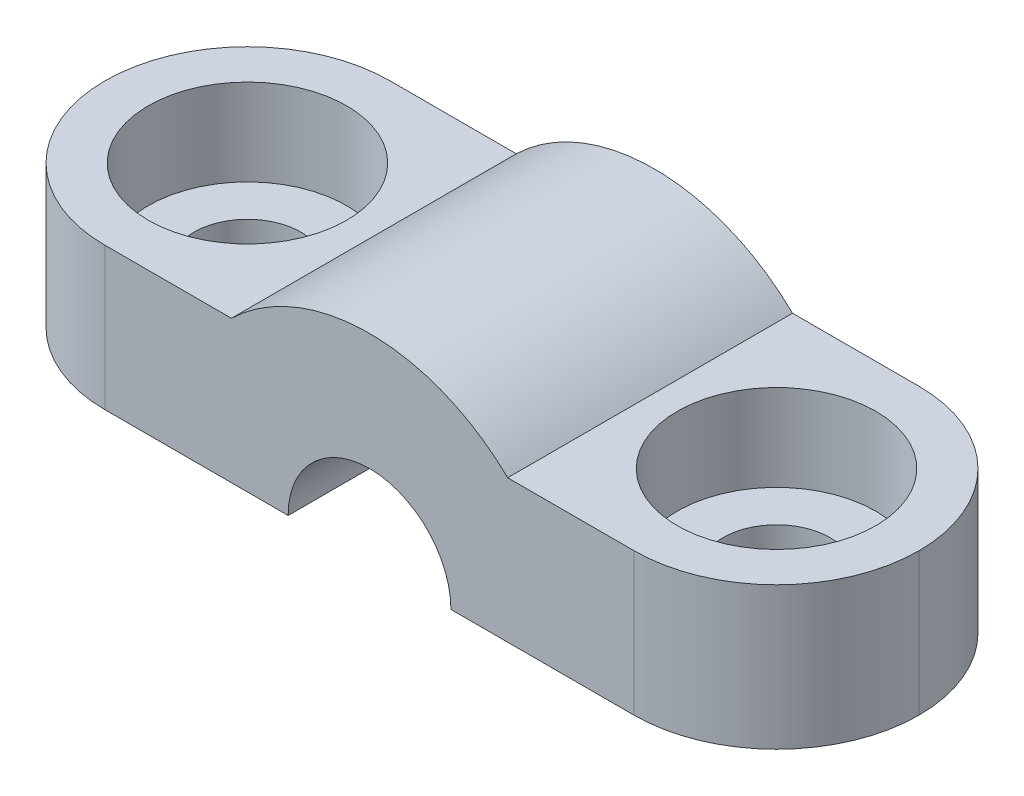
ISO-10303-21;
HEADER;
FILE_DESCRIPTION(('STEP AP214'),'2;1');
FILE_NAME('part.step','',(''),(''),'','','');
FILE_SCHEMA(('AUTOMOTIVE_DESIGN { 1 0 10303 214 1 1 1 1 }'));
ENDSEC;
DATA;
#1=APPLICATION_CONTEXT('core data for automotive mechanical design processes');
#2=APPLICATION_PROTOCOL_DEFINITION('international standard','automotive_design',2000,#1);
#3=PRODUCT_CONTEXT('',#1,'mechanical');
#4=PRODUCT('Part','Part','',(#3));
#5=PRODUCT_RELATED_PRODUCT_CATEGORY('part','',(#4));
#6=PRODUCT_DEFINITION_FORMATION('','',#4);
#7=PRODUCT_DEFINITION_CONTEXT('part definition',#1,'design');
#8=PRODUCT_DEFINITION('design','',#6,#7);
#9=PRODUCT_DEFINITION_SHAPE('','',#8);
#10=(LENGTH_UNIT() NAMED_UNIT(*) SI_UNIT(.MILLI.,.METRE.));
#11=(NAMED_UNIT(*) PLANE_ANGLE_UNIT() SI_UNIT($,.RADIAN.));
#12=(NAMED_UNIT(*) SI_UNIT($,.STERADIAN.) SOLID_ANGLE_UNIT());
#13=UNCERTAINTY_MEASURE_WITH_UNIT(LENGTH_MEASURE(1.E-05),#10,'distance_accuracy_value','');
#14=(GEOMETRIC_REPRESENTATION_CONTEXT(3) GLOBAL_UNCERTAINTY_ASSIGNED_CONTEXT((#13)) GLOBAL_UNIT_ASSIGNED_CONTEXT((#10,
#11,#12)) REPRESENTATION_CONTEXT('',''));
#15=CARTESIAN_POINT('',(0.,0.,0.));
#16=DIRECTION('',(0.,0.,1.));
#17=DIRECTION('',(1.,0.,0.));
#18=AXIS2_PLACEMENT_3D('',#15,#16,#17);
#19=CARTESIAN_POINT('',(20.,0.,7.));
#20=DIRECTION('',(0.,1.,0.));
#21=DIRECTION('',(0.,0.,1.));
#22=AXIS2_PLACEMENT_3D('',#19,#20,#21);
#23=PLANE('',#22);
#24=CARTESIAN_POINT('',(-13.,0.,0.));
#25=DIRECTION('',(0.,1.,0.));
#26=DIRECTION('',(0.,0.,1.));
#27=AXIS2_PLACEMENT_3D('',#24,#25,#26);
#28=CIRCLE('',#27,2.625);
#29=CARTESIAN_POINT('',(-13.,0.,2.625));
#30=VERTEX_POINT('',#29);
#31=EDGE_CURVE('E167',#30,#30,#28,.T.);
#32=ORIENTED_EDGE('',*,*,#31,.T.);
#33=EDGE_LOOP('',(#32));
#34=FACE_BOUND('',#33,.T.);
#35=DIRECTION('',(-1.,0.,0.));
#36=VECTOR('',#35,1.);
#37=CARTESIAN_POINT('',(-20.,0.,-7.));
#38=LINE('',#37,#36);
#39=CARTESIAN_POINT('',(-4.00000000000001,0.,-7.));
#40=VERTEX_POINT('',#39);
#41=CARTESIAN_POINT('',(-13.,0.,-7.));
#42=VERTEX_POINT('',#41);
#43=EDGE_CURVE('E132',#40,#42,#38,.T.);
#44=ORIENTED_EDGE('',*,*,#43,.F.);
#45=DIRECTION('',(0.,0.,1.));
#46=VECTOR('',#45,1.);
#47=CARTESIAN_POINT('',(-4.00000000000001,0.,-7.));
#48=LINE('',#47,#46);
#49=CARTESIAN_POINT('',(-4.00000000000001,0.,7.));
#50=VERTEX_POINT('',#49);
#51=EDGE_CURVE('E11',#40,#50,#48,.T.);
#52=ORIENTED_EDGE('',*,*,#51,.T.);
#53=DIRECTION('',(1.,0.,0.));
#54=VECTOR('',#53,1.);
#55=CARTESIAN_POINT('',(-20.,0.,7.));
#56=LINE('',#55,#54);
#57=CARTESIAN_POINT('',(-13.,0.,7.));
#58=VERTEX_POINT('',#57);
#59=EDGE_CURVE('E123',#58,#50,#56,.T.);
#60=ORIENTED_EDGE('',*,*,#59,.F.);
#61=CARTESIAN_POINT('',(-13.,0.,0.));
#62=DIRECTION('',(0.,1.,0.));
#63=DIRECTION('',(0.,0.,1.));
#64=AXIS2_PLACEMENT_3D('',#61,#62,#63);
#65=CIRCLE('',#64,7.);
#66=CARTESIAN_POINT('',(-20.,0.,0.));
#67=VERTEX_POINT('',#66);
#68=EDGE_CURVE('E144',#58,#67,#65,.F.);
#69=ORIENTED_EDGE('',*,*,#68,.T.);
#70=CARTESIAN_POINT('',(-13.,0.,0.));
#71=DIRECTION('',(0.,1.,0.));
#72=DIRECTION('',(0.,0.,1.));
#73=AXIS2_PLACEMENT_3D('',#70,#71,#72);
#74=CIRCLE('',#73,7.);
#75=EDGE_CURVE('E141',#67,#42,#74,.F.);
#76=ORIENTED_EDGE('',*,*,#75,.T.);
#77=EDGE_LOOP('',(#44,#52,#60,#69,#76));
#78=FACE_BOUND('',#77,.T.);
#79=ADVANCED_FACE('F33',(#34,#78),#23,.F.);
#80=CARTESIAN_POINT('',(20.,7.,7.));
#81=DIRECTION('',(0.,1.,0.));
#82=DIRECTION('',(0.,0.,1.));
#83=AXIS2_PLACEMENT_3D('',#80,#81,#82);
#84=PLANE('',#83);
#85=DIRECTION('',(0.,0.,1.));
#86=VECTOR('',#85,1.);
#87=CARTESIAN_POINT('',(-6.78693598024911,7.,-20.8496389844645));
#88=LINE('',#87,#86);
#89=CARTESIAN_POINT('',(-6.78693598024911,7.,-7.));
#90=VERTEX_POINT('',#89);
#91=CARTESIAN_POINT('',(-6.78693598024911,7.,7.));
#92=VERTEX_POINT('',#91);
#93=EDGE_CURVE('E190',#90,#92,#88,.T.);
#94=ORIENTED_EDGE('',*,*,#93,.F.);
#95=DIRECTION('',(-1.,0.,0.));
#96=VECTOR('',#95,1.);
#97=CARTESIAN_POINT('',(-20.,7.,-7.));
#98=LINE('',#97,#96);
#99=CARTESIAN_POINT('',(-13.,7.,-7.));
#100=VERTEX_POINT('',#99);
#101=EDGE_CURVE('E131',#90,#100,#98,.T.);
#102=ORIENTED_EDGE('',*,*,#101,.T.);
#103=CARTESIAN_POINT('',(-13.,7.,0.));
#104=DIRECTION('',(0.,1.,0.));
#105=DIRECTION('',(0.,0.,1.));
#106=AXIS2_PLACEMENT_3D('',#103,#104,#105);
#107=CIRCLE('',#106,7.);
#108=CARTESIAN_POINT('',(-20.,7.,0.));
#109=VERTEX_POINT('',#108);
#110=EDGE_CURVE('E149',#100,#109,#107,.T.);
#111=ORIENTED_EDGE('',*,*,#110,.T.);
#112=CARTESIAN_POINT('',(-13.,7.,0.));
#113=DIRECTION('',(0.,1.,0.));
#114=DIRECTION('',(0.,0.,1.));
#115=AXIS2_PLACEMENT_3D('',#112,#113,#114);
#116=CIRCLE('',#115,7.);
#117=CARTESIAN_POINT('',(-13.,7.,7.));
#118=VERTEX_POINT('',#117);
#119=EDGE_CURVE('E151',#109,#118,#116,.T.);
#120=ORIENTED_EDGE('',*,*,#119,.T.);
#121=DIRECTION('',(1.,0.,0.));
#122=VECTOR('',#121,1.);
#123=CARTESIAN_POINT('',(-20.,7.,7.));
#124=LINE('',#123,#122);
#125=EDGE_CURVE('E139',#118,#92,#124,.T.);
#126=ORIENTED_EDGE('',*,*,#125,.T.);
#127=EDGE_LOOP('',(#94,#102,#111,#120,#126));
#128=FACE_BOUND('',#127,.T.);
#129=CARTESIAN_POINT('',(-13.,7.,0.));
#130=DIRECTION('',(0.,1.,0.));
#131=DIRECTION('',(0.,0.,1.));
#132=AXIS2_PLACEMENT_3D('',#129,#130,#131);
#133=CIRCLE('',#132,4.875);
#134=CARTESIAN_POINT('',(-13.,7.,4.875));
#135=VERTEX_POINT('',#134);
#136=EDGE_CURVE('E175',#135,#135,#133,.T.);
#137=ORIENTED_EDGE('',*,*,#136,.F.);
#138=EDGE_LOOP('',(#137));
#139=FACE_BOUND('',#138,.T.);
#140=ADVANCED_FACE('F237',(#128,#139),#84,.T.);
#141=CARTESIAN_POINT('',(-13.,0.,0.));
#142=DIRECTION('',(0.,1.,0.));
#143=DIRECTION('',(0.,0.,1.));
#144=AXIS2_PLACEMENT_3D('',#141,#142,#143);
#145=CYLINDRICAL_SURFACE('',#144,2.625);
#146=ORIENTED_EDGE('',*,*,#31,.F.);
#147=EDGE_LOOP('',(#146));
#148=FACE_BOUND('',#147,.T.);
#149=CARTESIAN_POINT('',(-13.,2.75,0.));
#150=DIRECTION('',(0.,1.,0.));
#151=DIRECTION('',(0.,0.,1.));
#152=AXIS2_PLACEMENT_3D('',#149,#150,#151);
#153=CIRCLE('',#152,2.625);
#154=CARTESIAN_POINT('',(-13.,2.75,2.625));
#155=VERTEX_POINT('',#154);
#156=EDGE_CURVE('E168',#155,#155,#153,.F.);
#157=ORIENTED_EDGE('',*,*,#156,.F.);
#158=EDGE_LOOP('',(#157));
#159=FACE_BOUND('',#158,.T.);
#160=ADVANCED_FACE('F256',(#148,#159),#145,.F.);
#161=CARTESIAN_POINT('',(-20.,7.,-7.));
#162=DIRECTION('',(0.,0.,1.));
#163=DIRECTION('',(1.,0.,0.));
#164=AXIS2_PLACEMENT_3D('',#161,#162,#163);
#165=PLANE('',#164);
#166=CARTESIAN_POINT('',(13.,0.,-7.));
#167=VERTEX_POINT('',#166);
#168=CARTESIAN_POINT('',(3.99999999999999,0.,-7.));
#169=VERTEX_POINT('',#168);
#170=EDGE_CURVE('E129',#167,#169,#38,.T.);
#171=ORIENTED_EDGE('',*,*,#170,.T.);
#172=CARTESIAN_POINT('',(0.,0.,-7.));
#173=DIRECTION('',(0.,0.,1.));
#174=DIRECTION('',(1.,0.,0.));
#175=AXIS2_PLACEMENT_3D('',#172,#173,#174);
#176=CIRCLE('',#175,4.);
#177=EDGE_CURVE('E48',#169,#40,#176,.T.);
#178=ORIENTED_EDGE('',*,*,#177,.T.);
#179=ORIENTED_EDGE('',*,*,#43,.T.);
#180=DIRECTION('',(0.,-1.,0.));
#181=VECTOR('',#180,1.);
#182=CARTESIAN_POINT('',(-13.,7.,-7.));
#183=LINE('',#182,#181);
#184=EDGE_CURVE('E157',#42,#100,#183,.F.);
#185=ORIENTED_EDGE('',*,*,#184,.T.);
#186=ORIENTED_EDGE('',*,*,#101,.F.);
#187=CARTESIAN_POINT('',(0.,0.,-7.));
#188=DIRECTION('',(0.,0.,1.));
#189=DIRECTION('',(1.,0.,0.));
#190=AXIS2_PLACEMENT_3D('',#187,#188,#189);
#191=CIRCLE('',#190,9.75);
#192=CARTESIAN_POINT('',(6.78693598024911,7.,-7.));
#193=VERTEX_POINT('',#192);
#194=EDGE_CURVE('E187',#90,#193,#191,.F.);
#195=ORIENTED_EDGE('',*,*,#194,.T.);
#196=CARTESIAN_POINT('',(13.,7.,-7.));
#197=VERTEX_POINT('',#196);
#198=EDGE_CURVE('E56',#197,#193,#98,.T.);
#199=ORIENTED_EDGE('',*,*,#198,.F.);
#200=DIRECTION('',(0.,-1.,0.));
#201=VECTOR('',#200,1.);
#202=CARTESIAN_POINT('',(13.,7.,-7.));
#203=LINE('',#202,#201);
#204=EDGE_CURVE('E114',#197,#167,#203,.T.);
#205=ORIENTED_EDGE('',*,*,#204,.T.);
#206=EDGE_LOOP('',(#171,#178,#179,#185,#186,#195,#199,#205));
#207=FACE_BOUND('',#206,.T.);
#208=ADVANCED_FACE('F220',(#207),#165,.F.);
#209=CARTESIAN_POINT('',(-20.,7.,7.));
#210=DIRECTION('',(0.,0.,-1.));
#211=DIRECTION('',(-1.,0.,0.));
#212=AXIS2_PLACEMENT_3D('',#209,#210,#211);
#213=PLANE('',#212);
#214=ORIENTED_EDGE('',*,*,#59,.T.);
#215=CARTESIAN_POINT('',(0.,0.,7.));
#216=DIRECTION('',(0.,0.,1.));
#217=DIRECTION('',(1.,0.,0.));
#218=AXIS2_PLACEMENT_3D('',#215,#216,#217);
#219=CIRCLE('',#218,4.);
#220=CARTESIAN_POINT('',(3.99999999999999,0.,7.));
#221=VERTEX_POINT('',#220);
#222=EDGE_CURVE('E109',#221,#50,#219,.T.);
#223=ORIENTED_EDGE('',*,*,#222,.F.);
#224=CARTESIAN_POINT('',(13.,0.,7.));
#225=VERTEX_POINT('',#224);
#226=EDGE_CURVE('E119',#221,#225,#56,.T.);
#227=ORIENTED_EDGE('',*,*,#226,.T.);
#228=DIRECTION('',(0.,-1.,0.));
#229=VECTOR('',#228,1.);
#230=CARTESIAN_POINT('',(13.,7.,7.));
#231=LINE('',#230,#229);
#232=CARTESIAN_POINT('',(13.,7.,7.));
#233=VERTEX_POINT('',#232);
#234=EDGE_CURVE('E136',#225,#233,#231,.F.);
#235=ORIENTED_EDGE('',*,*,#234,.T.);
#236=CARTESIAN_POINT('',(6.78693598024911,7.,7.));
#237=VERTEX_POINT('',#236);
#238=EDGE_CURVE('E199',#237,#233,#124,.T.);
#239=ORIENTED_EDGE('',*,*,#238,.F.);
#240=CARTESIAN_POINT('',(0.,0.,7.));
#241=DIRECTION('',(0.,0.,1.));
#242=DIRECTION('',(1.,0.,0.));
#243=AXIS2_PLACEMENT_3D('',#240,#241,#242);
#244=CIRCLE('',#243,9.75);
#245=EDGE_CURVE('E225',#237,#92,#244,.T.);
#246=ORIENTED_EDGE('',*,*,#245,.T.);
#247=ORIENTED_EDGE('',*,*,#125,.F.);
#248=DIRECTION('',(0.,-1.,0.));
#249=VECTOR('',#248,1.);
#250=CARTESIAN_POINT('',(-13.,7.,7.));
#251=LINE('',#250,#249);
#252=EDGE_CURVE('E138',#118,#58,#251,.T.);
#253=ORIENTED_EDGE('',*,*,#252,.T.);
#254=EDGE_LOOP('',(#214,#223,#227,#235,#239,#246,#247,#253));
#255=FACE_BOUND('',#254,.T.);
#256=ADVANCED_FACE('F117',(#255),#213,.F.);
#257=DIRECTION('',(0.,0.,1.));
#258=VECTOR('',#257,1.);
#259=CARTESIAN_POINT('',(6.78693598024911,7.,-20.8496389844645));
#260=LINE('',#259,#258);
#261=EDGE_CURVE('E210',#193,#237,#260,.T.);
#262=ORIENTED_EDGE('',*,*,#261,.T.);
#263=ORIENTED_EDGE('',*,*,#238,.T.);
#264=CARTESIAN_POINT('',(13.,7.,0.));
#265=DIRECTION('',(0.,1.,0.));
#266=DIRECTION('',(0.,0.,1.));
#267=AXIS2_PLACEMENT_3D('',#264,#265,#266);
#268=CIRCLE('',#267,7.);
#269=CARTESIAN_POINT('',(20.,7.,0.));
#270=VERTEX_POINT('',#269);
#271=EDGE_CURVE('E155',#233,#270,#268,.T.);
#272=ORIENTED_EDGE('',*,*,#271,.T.);
#273=CARTESIAN_POINT('',(13.,7.,0.));
#274=DIRECTION('',(0.,1.,0.));
#275=DIRECTION('',(0.,0.,1.));
#276=AXIS2_PLACEMENT_3D('',#273,#274,#275);
#277=CIRCLE('',#276,7.);
#278=EDGE_CURVE('E153',#270,#197,#277,.T.);
#279=ORIENTED_EDGE('',*,*,#278,.T.);
#280=ORIENTED_EDGE('',*,*,#198,.T.);
#281=EDGE_LOOP('',(#262,#263,#272,#279,#280));
#282=FACE_BOUND('',#281,.T.);
#283=CARTESIAN_POINT('',(13.,7.,0.));
#284=DIRECTION('',(0.,1.,0.));
#285=DIRECTION('',(0.,0.,-1.));
#286=AXIS2_PLACEMENT_3D('',#283,#284,#285);
#287=CIRCLE('',#286,4.875);
#288=CARTESIAN_POINT('',(13.,7.,-4.875));
#289=VERTEX_POINT('',#288);
#290=EDGE_CURVE('E182',#289,#289,#287,.T.);
#291=ORIENTED_EDGE('',*,*,#290,.F.);
#292=EDGE_LOOP('',(#291));
#293=FACE_BOUND('',#292,.T.);
#294=ADVANCED_FACE('F206',(#282,#293),#84,.T.);
#295=CARTESIAN_POINT('',(13.,0.,0.));
#296=DIRECTION('',(0.,1.,0.));
#297=DIRECTION('',(0.,0.,-1.));
#298=AXIS2_PLACEMENT_3D('',#295,#296,#297);
#299=CIRCLE('',#298,2.625);
#300=CARTESIAN_POINT('',(13.,0.,-2.625));
#301=VERTEX_POINT('',#300);
#302=EDGE_CURVE('E171',#301,#301,#299,.T.);
#303=ORIENTED_EDGE('',*,*,#302,.T.);
#304=EDGE_LOOP('',(#303));
#305=FACE_BOUND('',#304,.T.);
#306=ORIENTED_EDGE('',*,*,#226,.F.);
#307=DIRECTION('',(0.,0.,1.));
#308=VECTOR('',#307,1.);
#309=CARTESIAN_POINT('',(3.99999999999999,0.,-7.));
#310=LINE('',#309,#308);
#311=EDGE_CURVE('E41',#221,#169,#310,.F.);
#312=ORIENTED_EDGE('',*,*,#311,.T.);
#313=ORIENTED_EDGE('',*,*,#170,.F.);
#314=CARTESIAN_POINT('',(13.,0.,0.));
#315=DIRECTION('',(0.,1.,0.));
#316=DIRECTION('',(0.,0.,1.));
#317=AXIS2_PLACEMENT_3D('',#314,#315,#316);
#318=CIRCLE('',#317,7.);
#319=CARTESIAN_POINT('',(20.,0.,0.));
#320=VERTEX_POINT('',#319);
#321=EDGE_CURVE('E146',#167,#320,#318,.F.);
#322=ORIENTED_EDGE('',*,*,#321,.T.);
#323=CARTESIAN_POINT('',(13.,0.,0.));
#324=DIRECTION('',(0.,1.,0.));
#325=DIRECTION('',(0.,0.,1.));
#326=AXIS2_PLACEMENT_3D('',#323,#324,#325);
#327=CIRCLE('',#326,7.);
#328=EDGE_CURVE('E127',#320,#225,#327,.F.);
#329=ORIENTED_EDGE('',*,*,#328,.T.);
#330=EDGE_LOOP('',(#306,#312,#313,#322,#329));
#331=FACE_BOUND('',#330,.T.);
#332=ADVANCED_FACE('F125',(#305,#331),#23,.F.);
#333=CARTESIAN_POINT('',(-13.,7.,0.));
#334=DIRECTION('',(0.,-1.,0.));
#335=DIRECTION('',(0.,0.,-1.));
#336=AXIS2_PLACEMENT_3D('',#333,#334,#335);
#337=CYLINDRICAL_SURFACE('',#336,7.);
#338=DIRECTION('',(0.,-1.,0.));
#339=VECTOR('',#338,1.);
#340=CARTESIAN_POINT('',(-20.,7.,0.));
#341=LINE('',#340,#339);
#342=EDGE_CURVE('E161',#109,#67,#341,.T.);
#343=ORIENTED_EDGE('',*,*,#342,.F.);
#344=ORIENTED_EDGE('',*,*,#110,.F.);
#345=ORIENTED_EDGE('',*,*,#184,.F.);
#346=ORIENTED_EDGE('',*,*,#75,.F.);
#347=EDGE_LOOP('',(#343,#344,#345,#346));
#348=FACE_BOUND('',#347,.T.);
#349=ADVANCED_FACE('F235',(#348),#337,.T.);
#350=CARTESIAN_POINT('',(-13.,7.,0.));
#351=DIRECTION('',(0.,-1.,0.));
#352=DIRECTION('',(0.,0.,-1.));
#353=AXIS2_PLACEMENT_3D('',#350,#351,#352);
#354=CYLINDRICAL_SURFACE('',#353,7.);
#355=ORIENTED_EDGE('',*,*,#119,.F.);
#356=ORIENTED_EDGE('',*,*,#342,.T.);
#357=ORIENTED_EDGE('',*,*,#68,.F.);
#358=ORIENTED_EDGE('',*,*,#252,.F.);
#359=EDGE_LOOP('',(#355,#356,#357,#358));
#360=FACE_BOUND('',#359,.T.);
#361=ADVANCED_FACE('F241',(#360),#354,.T.);
#362=CARTESIAN_POINT('',(13.,7.,0.));
#363=DIRECTION('',(0.,-1.,0.));
#364=DIRECTION('',(0.,0.,-1.));
#365=AXIS2_PLACEMENT_3D('',#362,#363,#364);
#366=CYLINDRICAL_SURFACE('',#365,7.);
#367=ORIENTED_EDGE('',*,*,#204,.F.);
#368=ORIENTED_EDGE('',*,*,#278,.F.);
#369=DIRECTION('',(0.,-1.,0.));
#370=VECTOR('',#369,1.);
#371=CARTESIAN_POINT('',(20.,7.,0.));
#372=LINE('',#371,#370);
#373=EDGE_CURVE('E164',#320,#270,#372,.F.);
#374=ORIENTED_EDGE('',*,*,#373,.F.);
#375=ORIENTED_EDGE('',*,*,#321,.F.);
#376=EDGE_LOOP('',(#367,#368,#374,#375));
#377=FACE_BOUND('',#376,.T.);
#378=ADVANCED_FACE('F35',(#377),#366,.T.);
#379=CARTESIAN_POINT('',(13.,7.,0.));
#380=DIRECTION('',(0.,-1.,0.));
#381=DIRECTION('',(0.,0.,-1.));
#382=AXIS2_PLACEMENT_3D('',#379,#380,#381);
#383=CYLINDRICAL_SURFACE('',#382,7.);
#384=ORIENTED_EDGE('',*,*,#271,.F.);
#385=ORIENTED_EDGE('',*,*,#234,.F.);
#386=ORIENTED_EDGE('',*,*,#328,.F.);
#387=ORIENTED_EDGE('',*,*,#373,.T.);
#388=EDGE_LOOP('',(#384,#385,#386,#387));
#389=FACE_BOUND('',#388,.T.);
#390=ADVANCED_FACE('F214',(#389),#383,.T.);
#391=CARTESIAN_POINT('',(13.,0.,0.));
#392=DIRECTION('',(0.,1.,0.));
#393=DIRECTION('',(0.,0.,1.));
#394=AXIS2_PLACEMENT_3D('',#391,#392,#393);
#395=CYLINDRICAL_SURFACE('',#394,2.625);
#396=CARTESIAN_POINT('',(13.,2.75,0.));
#397=DIRECTION('',(0.,-1.,0.));
#398=DIRECTION('',(0.,0.,-1.));
#399=AXIS2_PLACEMENT_3D('',#396,#397,#398);
#400=CIRCLE('',#399,2.625);
#401=CARTESIAN_POINT('',(13.,2.75,-2.625));
#402=VERTEX_POINT('',#401);
#403=EDGE_CURVE('E173',#402,#402,#400,.F.);
#404=ORIENTED_EDGE('',*,*,#403,.T.);
#405=EDGE_LOOP('',(#404));
#406=FACE_BOUND('',#405,.T.);
#407=ORIENTED_EDGE('',*,*,#302,.F.);
#408=EDGE_LOOP('',(#407));
#409=FACE_BOUND('',#408,.T.);
#410=ADVANCED_FACE('F266',(#406,#409),#395,.F.);
#411=CARTESIAN_POINT('',(-13.,2.75,0.));
#412=DIRECTION('',(0.,1.,0.));
#413=DIRECTION('',(0.,0.,1.));
#414=AXIS2_PLACEMENT_3D('',#411,#412,#413);
#415=PLANE('',#414);
#416=CARTESIAN_POINT('',(-13.,2.75,0.));
#417=DIRECTION('',(0.,1.,0.));
#418=DIRECTION('',(0.,0.,1.));
#419=AXIS2_PLACEMENT_3D('',#416,#417,#418);
#420=CIRCLE('',#419,4.875);
#421=CARTESIAN_POINT('',(-13.,2.75,4.875));
#422=VERTEX_POINT('',#421);
#423=EDGE_CURVE('E172',#422,#422,#420,.T.);
#424=ORIENTED_EDGE('',*,*,#423,.T.);
#425=EDGE_LOOP('',(#424));
#426=FACE_BOUND('',#425,.T.);
#427=ORIENTED_EDGE('',*,*,#156,.T.);
#428=EDGE_LOOP('',(#427));
#429=FACE_BOUND('',#428,.T.);
#430=ADVANCED_FACE('F268',(#426,#429),#415,.T.);
#431=CARTESIAN_POINT('',(-13.,2.75,0.));
#432=DIRECTION('',(0.,1.,0.));
#433=DIRECTION('',(0.,0.,1.));
#434=AXIS2_PLACEMENT_3D('',#431,#432,#433);
#435=CYLINDRICAL_SURFACE('',#434,4.875);
#436=ORIENTED_EDGE('',*,*,#423,.F.);
#437=EDGE_LOOP('',(#436));
#438=FACE_BOUND('',#437,.T.);
#439=ORIENTED_EDGE('',*,*,#136,.T.);
#440=EDGE_LOOP('',(#439));
#441=FACE_BOUND('',#440,.T.);
#442=ADVANCED_FACE('F274',(#438,#441),#435,.F.);
#443=CARTESIAN_POINT('',(13.,2.75,0.));
#444=DIRECTION('',(0.,-1.,0.));
#445=DIRECTION('',(0.,0.,-1.));
#446=AXIS2_PLACEMENT_3D('',#443,#444,#445);
#447=PLANE('',#446);
#448=CARTESIAN_POINT('',(13.,2.75,0.));
#449=DIRECTION('',(0.,1.,0.));
#450=DIRECTION('',(0.,0.,-1.));
#451=AXIS2_PLACEMENT_3D('',#448,#449,#450);
#452=CIRCLE('',#451,4.875);
#453=CARTESIAN_POINT('',(13.,2.75,-4.875));
#454=VERTEX_POINT('',#453);
#455=EDGE_CURVE('E176',#454,#454,#452,.T.);
#456=ORIENTED_EDGE('',*,*,#455,.T.);
#457=EDGE_LOOP('',(#456));
#458=FACE_BOUND('',#457,.T.);
#459=ORIENTED_EDGE('',*,*,#403,.F.);
#460=EDGE_LOOP('',(#459));
#461=FACE_BOUND('',#460,.T.);
#462=ADVANCED_FACE('F340',(#458,#461),#447,.F.);
#463=CARTESIAN_POINT('',(13.,2.75,0.));
#464=DIRECTION('',(0.,1.,0.));
#465=DIRECTION('',(0.,0.,1.));
#466=AXIS2_PLACEMENT_3D('',#463,#464,#465);
#467=CYLINDRICAL_SURFACE('',#466,4.875);
#468=ORIENTED_EDGE('',*,*,#455,.F.);
#469=EDGE_LOOP('',(#468));
#470=FACE_BOUND('',#469,.T.);
#471=ORIENTED_EDGE('',*,*,#290,.T.);
#472=EDGE_LOOP('',(#471));
#473=FACE_BOUND('',#472,.T.);
#474=ADVANCED_FACE('F311',(#470,#473),#467,.F.);
#475=CARTESIAN_POINT('',(0.,0.,-20.8496389844645));
#476=DIRECTION('',(0.,0.,1.));
#477=DIRECTION('',(1.,0.,0.));
#478=AXIS2_PLACEMENT_3D('',#475,#476,#477);
#479=CYLINDRICAL_SURFACE('',#478,9.75);
#480=ORIENTED_EDGE('',*,*,#194,.F.);
#481=ORIENTED_EDGE('',*,*,#93,.T.);
#482=ORIENTED_EDGE('',*,*,#245,.F.);
#483=ORIENTED_EDGE('',*,*,#261,.F.);
#484=EDGE_LOOP('',(#480,#481,#482,#483));
#485=FACE_BOUND('',#484,.T.);
#486=ADVANCED_FACE('F224',(#485),#479,.T.);
#487=CARTESIAN_POINT('',(0.,0.,-7.));
#488=DIRECTION('',(0.,0.,1.));
#489=DIRECTION('',(1.,0.,0.));
#490=AXIS2_PLACEMENT_3D('',#487,#488,#489);
#491=CYLINDRICAL_SURFACE('',#490,4.);
#492=ORIENTED_EDGE('',*,*,#177,.F.);
#493=ORIENTED_EDGE('',*,*,#311,.F.);
#494=ORIENTED_EDGE('',*,*,#222,.T.);
#495=ORIENTED_EDGE('',*,*,#51,.F.);
#496=EDGE_LOOP('',(#492,#493,#494,#495));
#497=FACE_BOUND('',#496,.T.);
#498=ADVANCED_FACE('F108',(#497),#491,.F.);
#499=CLOSED_SHELL('',(#79,#140,#160,#208,#256,#294,#332,#349,#361,#378,#390,#410,#430,#442,#462,
#474,#486,#498));
#500=MANIFOLD_SOLID_BREP('B2',#499);
#501=ADVANCED_BREP_SHAPE_REPRESENTATION('',(#18,#500),#14);
#502=SHAPE_DEFINITION_REPRESENTATION(#9,#501);
ENDSEC;
END-ISO-10303-21;
